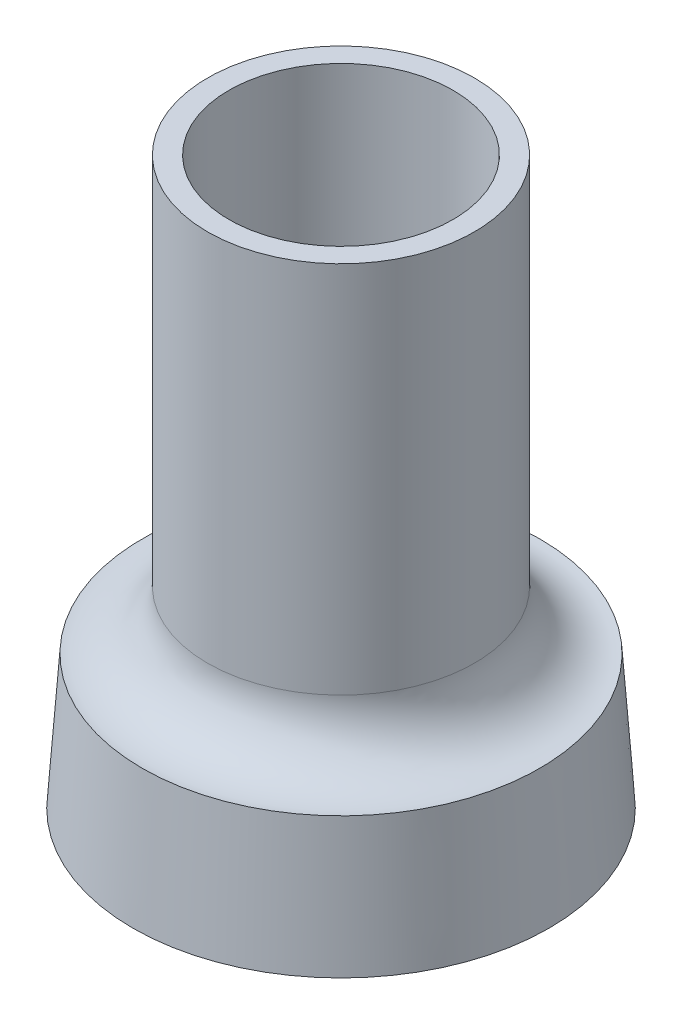
ISO-10303-21;
HEADER;
FILE_DESCRIPTION(('STEP AP214'),'2;1');
FILE_NAME('part.step','',(''),(''),'','','');
FILE_SCHEMA(('AUTOMOTIVE_DESIGN { 1 0 10303 214 1 1 1 1 }'));
ENDSEC;
DATA;
#1=APPLICATION_CONTEXT('core data for automotive mechanical design processes');
#2=APPLICATION_PROTOCOL_DEFINITION('international standard','automotive_design',2000,#1);
#3=PRODUCT_CONTEXT('',#1,'mechanical');
#4=PRODUCT('Part','Part','',(#3));
#5=PRODUCT_RELATED_PRODUCT_CATEGORY('part','',(#4));
#6=PRODUCT_DEFINITION_FORMATION('','',#4);
#7=PRODUCT_DEFINITION_CONTEXT('part definition',#1,'design');
#8=PRODUCT_DEFINITION('design','',#6,#7);
#9=PRODUCT_DEFINITION_SHAPE('','',#8);
#10=(LENGTH_UNIT() NAMED_UNIT(*) SI_UNIT(.MILLI.,.METRE.));
#11=(NAMED_UNIT(*) PLANE_ANGLE_UNIT() SI_UNIT($,.RADIAN.));
#12=(NAMED_UNIT(*) SI_UNIT($,.STERADIAN.) SOLID_ANGLE_UNIT());
#13=UNCERTAINTY_MEASURE_WITH_UNIT(LENGTH_MEASURE(1.E-05),#10,'distance_accuracy_value','');
#14=(GEOMETRIC_REPRESENTATION_CONTEXT(3) GLOBAL_UNCERTAINTY_ASSIGNED_CONTEXT((#13)) GLOBAL_UNIT_ASSIGNED_CONTEXT((#10,
#11,#12)) REPRESENTATION_CONTEXT('',''));
#15=CARTESIAN_POINT('',(0.,0.,0.));
#16=DIRECTION('',(0.,0.,1.));
#17=DIRECTION('',(1.,0.,0.));
#18=AXIS2_PLACEMENT_3D('',#15,#16,#17);
#19=CARTESIAN_POINT('',(0.,1.06042940554287,0.));
#20=DIRECTION('',(0.,-1.,0.));
#21=DIRECTION('',(0.,0.,-1.));
#22=AXIS2_PLACEMENT_3D('',#19,#20,#21);
#23=CONICAL_SURFACE('',#22,1.675359172763,0.0698131700797734);
#24=CARTESIAN_POINT('',(0.,-0.0139512947488257,0.));
#25=DIRECTION('',(0.,-1.,0.));
#26=DIRECTION('',(0.,0.,-1.));
#27=AXIS2_PLACEMENT_3D('',#24,#25,#26);
#28=CIRCLE('',#27,1.75048718994804);
#29=CARTESIAN_POINT('',(0.,-0.0139512947488257,-1.75048718994804));
#30=VERTEX_POINT('',#29);
#31=EDGE_CURVE('E10',#30,#30,#28,.T.);
#32=ORIENTED_EDGE('',*,*,#31,.T.);
#33=EDGE_LOOP('',(#32));
#34=FACE_BOUND('',#33,.T.);
#35=CARTESIAN_POINT('',(0.,1.06042940554287,0.));
#36=DIRECTION('',(0.,-1.,0.));
#37=DIRECTION('',(0.,0.,-1.));
#38=AXIS2_PLACEMENT_3D('',#35,#36,#37);
#39=CIRCLE('',#38,1.675359172763);
#40=CARTESIAN_POINT('',(0.,1.06042940554287,-1.675359172763));
#41=VERTEX_POINT('',#40);
#42=EDGE_CURVE('E59',#41,#41,#39,.T.);
#43=ORIENTED_EDGE('',*,*,#42,.F.);
#44=EDGE_LOOP('',(#43));
#45=FACE_BOUND('',#44,.T.);
#46=ADVANCED_FACE('F31',(#34,#45),#23,.F.);
#47=CARTESIAN_POINT('',(0.,0.,0.));
#48=DIRECTION('',(0.,1.,0.));
#49=DIRECTION('',(0.,0.,1.));
#50=AXIS2_PLACEMENT_3D('',#47,#48,#49);
#51=CONICAL_SURFACE('',#50,1.95,1.50098315671512);
#52=ORIENTED_EDGE('',*,*,#31,.F.);
#53=EDGE_LOOP('',(#52));
#54=FACE_BOUND('',#53,.T.);
#55=CARTESIAN_POINT('',(0.,0.,0.));
#56=DIRECTION('',(0.,-1.,0.));
#57=DIRECTION('',(0.,0.,-1.));
#58=AXIS2_PLACEMENT_3D('',#55,#56,#57);
#59=CIRCLE('',#58,1.95);
#60=CARTESIAN_POINT('',(0.,0.,-1.95));
#61=VERTEX_POINT('',#60);
#62=EDGE_CURVE('E37',#61,#61,#59,.T.);
#63=ORIENTED_EDGE('',*,*,#62,.T.);
#64=EDGE_LOOP('',(#63));
#65=FACE_BOUND('',#64,.T.);
#66=ADVANCED_FACE('F67',(#54,#65),#51,.T.);
#67=CARTESIAN_POINT('',(0.,1.25354481010212,0.));
#68=DIRECTION('',(0.,-1.,0.));
#69=DIRECTION('',(0.,0.,-1.));
#70=AXIS2_PLACEMENT_3D('',#67,#68,#69);
#71=CONICAL_SURFACE('',#70,1.86234360780123,0.0698131700797734);
#72=ORIENTED_EDGE('',*,*,#62,.F.);
#73=EDGE_LOOP('',(#72));
#74=FACE_BOUND('',#73,.T.);
#75=CARTESIAN_POINT('',(0.,1.25354481010212,0.));
#76=DIRECTION('',(0.,-1.,0.));
#77=DIRECTION('',(0.,0.,-1.));
#78=AXIS2_PLACEMENT_3D('',#75,#76,#77);
#79=CIRCLE('',#78,1.86234360780123);
#80=CARTESIAN_POINT('',(0.,1.25354481010212,-1.86234360780123));
#81=VERTEX_POINT('',#80);
#82=EDGE_CURVE('E41',#81,#81,#79,.T.);
#83=ORIENTED_EDGE('',*,*,#82,.T.);
#84=EDGE_LOOP('',(#83));
#85=FACE_BOUND('',#84,.T.);
#86=ADVANCED_FACE('F71',(#74,#85),#71,.T.);
#87=CARTESIAN_POINT('',(0.,1.8,0.));
#88=DIRECTION('',(0.,-1.,0.));
#89=DIRECTION('',(0.,0.,-1.));
#90=AXIS2_PLACEMENT_3D('',#87,#88,#89);
#91=TOROIDAL_SURFACE('',#90,1.8,0.55);
#92=ORIENTED_EDGE('',*,*,#82,.F.);
#93=EDGE_LOOP('',(#92));
#94=FACE_BOUND('',#93,.T.);
#95=CARTESIAN_POINT('',(0.,1.8,0.));
#96=DIRECTION('',(0.,-1.,0.));
#97=DIRECTION('',(0.,0.,-1.));
#98=AXIS2_PLACEMENT_3D('',#95,#96,#97);
#99=CIRCLE('',#98,1.25);
#100=CARTESIAN_POINT('',(0.,1.8,-1.25));
#101=VERTEX_POINT('',#100);
#102=EDGE_CURVE('E45',#101,#101,#99,.T.);
#103=ORIENTED_EDGE('',*,*,#102,.T.);
#104=EDGE_LOOP('',(#103));
#105=FACE_BOUND('',#104,.T.);
#106=ADVANCED_FACE('F76',(#94,#105),#91,.F.);
#107=CARTESIAN_POINT('',(0.,0.,0.));
#108=DIRECTION('',(0.,-1.,0.));
#109=DIRECTION('',(0.,0.,-1.));
#110=AXIS2_PLACEMENT_3D('',#107,#108,#109);
#111=CYLINDRICAL_SURFACE('',#110,1.25);
#112=ORIENTED_EDGE('',*,*,#102,.F.);
#113=EDGE_LOOP('',(#112));
#114=FACE_BOUND('',#113,.T.);
#115=CARTESIAN_POINT('',(0.,5.3,0.));
#116=DIRECTION('',(0.,-1.,0.));
#117=DIRECTION('',(0.,0.,-1.));
#118=AXIS2_PLACEMENT_3D('',#115,#116,#117);
#119=CIRCLE('',#118,1.25);
#120=CARTESIAN_POINT('',(0.,5.3,-1.25));
#121=VERTEX_POINT('',#120);
#122=EDGE_CURVE('E50',#121,#121,#119,.T.);
#123=ORIENTED_EDGE('',*,*,#122,.T.);
#124=EDGE_LOOP('',(#123));
#125=FACE_BOUND('',#124,.T.);
#126=ADVANCED_FACE('F82',(#114,#125),#111,.T.);
#127=CARTESIAN_POINT('',(0.,5.3,-1.05));
#128=DIRECTION('',(0.,-1.,0.));
#129=DIRECTION('',(0.,0.,-1.));
#130=AXIS2_PLACEMENT_3D('',#127,#128,#129);
#131=PLANE('',#130);
#132=ORIENTED_EDGE('',*,*,#122,.F.);
#133=EDGE_LOOP('',(#132));
#134=FACE_BOUND('',#133,.T.);
#135=CARTESIAN_POINT('',(0.,5.3,0.));
#136=DIRECTION('',(0.,-1.,0.));
#137=DIRECTION('',(0.,0.,-1.));
#138=AXIS2_PLACEMENT_3D('',#135,#136,#137);
#139=CIRCLE('',#138,1.05);
#140=CARTESIAN_POINT('',(0.,5.3,-1.05));
#141=VERTEX_POINT('',#140);
#142=EDGE_CURVE('E53',#141,#141,#139,.T.);
#143=ORIENTED_EDGE('',*,*,#142,.T.);
#144=EDGE_LOOP('',(#143));
#145=FACE_BOUND('',#144,.T.);
#146=ADVANCED_FACE('F86',(#134,#145),#131,.F.);
#147=CARTESIAN_POINT('',(0.,0.,0.));
#148=DIRECTION('',(0.,-1.,0.));
#149=DIRECTION('',(0.,0.,-1.));
#150=AXIS2_PLACEMENT_3D('',#147,#148,#149);
#151=CYLINDRICAL_SURFACE('',#150,1.05);
#152=CARTESIAN_POINT('',(0.,1.8,0.));
#153=DIRECTION('',(0.,-1.,0.));
#154=DIRECTION('',(0.,0.,-1.));
#155=AXIS2_PLACEMENT_3D('',#152,#153,#154);
#156=CIRCLE('',#155,1.05);
#157=CARTESIAN_POINT('',(0.,1.8,-1.05));
#158=VERTEX_POINT('',#157);
#159=EDGE_CURVE('E56',#158,#158,#156,.T.);
#160=ORIENTED_EDGE('',*,*,#159,.T.);
#161=EDGE_LOOP('',(#160));
#162=FACE_BOUND('',#161,.T.);
#163=ORIENTED_EDGE('',*,*,#142,.F.);
#164=EDGE_LOOP('',(#163));
#165=FACE_BOUND('',#164,.T.);
#166=ADVANCED_FACE('F90',(#162,#165),#151,.F.);
#167=CARTESIAN_POINT('',(0.,1.8,0.));
#168=DIRECTION('',(0.,-1.,0.));
#169=DIRECTION('',(0.,0.,-1.));
#170=AXIS2_PLACEMENT_3D('',#167,#168,#169);
#171=TOROIDAL_SURFACE('',#170,1.8,0.75);
#172=ORIENTED_EDGE('',*,*,#42,.T.);
#173=EDGE_LOOP('',(#172));
#174=FACE_BOUND('',#173,.T.);
#175=ORIENTED_EDGE('',*,*,#159,.F.);
#176=EDGE_LOOP('',(#175));
#177=FACE_BOUND('',#176,.T.);
#178=ADVANCED_FACE('F63',(#174,#177),#171,.T.);
#179=CLOSED_SHELL('',(#46,#66,#86,#106,#126,#146,#166,#178));
#180=MANIFOLD_SOLID_BREP('B2',#179);
#181=ADVANCED_BREP_SHAPE_REPRESENTATION('',(#18,#180),#14);
#182=SHAPE_DEFINITION_REPRESENTATION(#9,#181);
ENDSEC;
END-ISO-10303-21;
